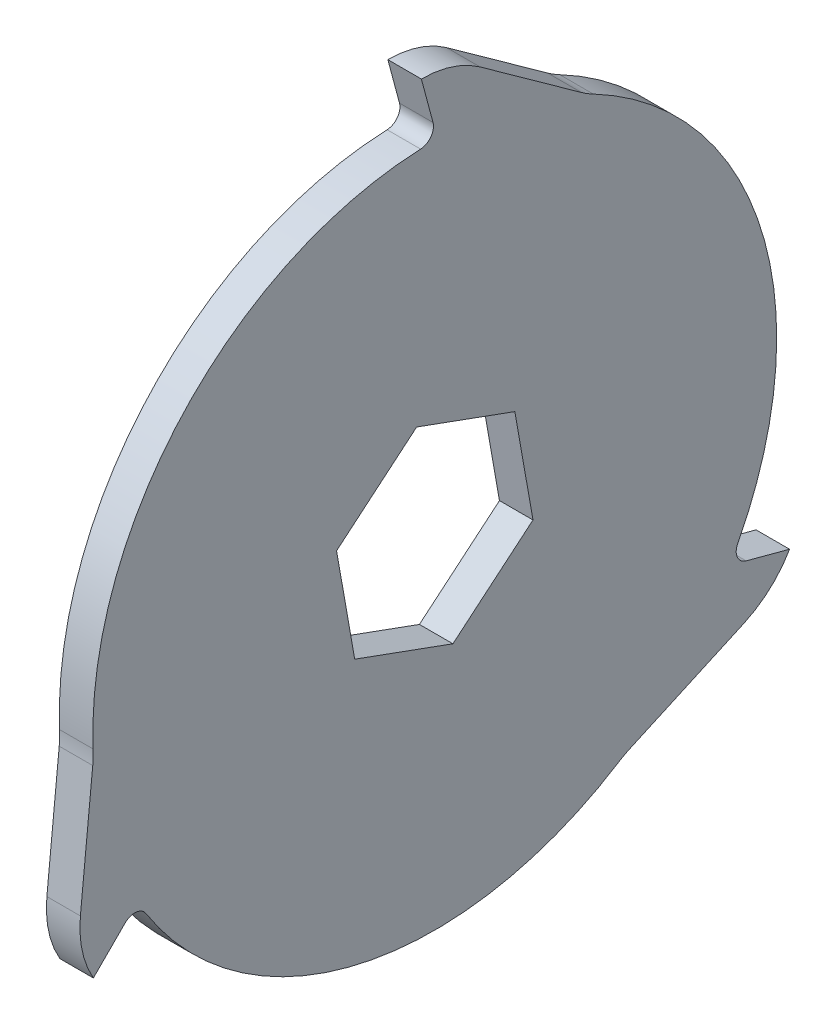
ISO-10303-21;
HEADER;
FILE_DESCRIPTION(('STEP AP214'),'2;1');
FILE_NAME('part.step','',(''),(''),'','','');
FILE_SCHEMA(('AUTOMOTIVE_DESIGN { 1 0 10303 214 1 1 1 1 }'));
ENDSEC;
DATA;
#1=APPLICATION_CONTEXT('core data for automotive mechanical design processes');
#2=APPLICATION_PROTOCOL_DEFINITION('international standard','automotive_design',2000,#1);
#3=PRODUCT_CONTEXT('',#1,'mechanical');
#4=PRODUCT('Part','Part','',(#3));
#5=PRODUCT_RELATED_PRODUCT_CATEGORY('part','',(#4));
#6=PRODUCT_DEFINITION_FORMATION('','',#4);
#7=PRODUCT_DEFINITION_CONTEXT('part definition',#1,'design');
#8=PRODUCT_DEFINITION('design','',#6,#7);
#9=PRODUCT_DEFINITION_SHAPE('','',#8);
#10=(LENGTH_UNIT() NAMED_UNIT(*) SI_UNIT(.MILLI.,.METRE.));
#11=(NAMED_UNIT(*) PLANE_ANGLE_UNIT() SI_UNIT($,.RADIAN.));
#12=(NAMED_UNIT(*) SI_UNIT($,.STERADIAN.) SOLID_ANGLE_UNIT());
#13=UNCERTAINTY_MEASURE_WITH_UNIT(LENGTH_MEASURE(1.E-05),#10,'distance_accuracy_value','');
#14=(GEOMETRIC_REPRESENTATION_CONTEXT(3) GLOBAL_UNCERTAINTY_ASSIGNED_CONTEXT((#13)) GLOBAL_UNIT_ASSIGNED_CONTEXT((#10,
#11,#12)) REPRESENTATION_CONTEXT('',''));
#15=CARTESIAN_POINT('',(0.,0.,0.));
#16=DIRECTION('',(0.,0.,1.));
#17=DIRECTION('',(1.,0.,0.));
#18=AXIS2_PLACEMENT_3D('',#15,#16,#17);
#19=CARTESIAN_POINT('',(2.5,0.,0.));
#20=DIRECTION('',(-1.,0.,0.));
#21=DIRECTION('',(0.,0.,1.));
#22=AXIS2_PLACEMENT_3D('',#19,#20,#21);
#23=CYLINDRICAL_SURFACE('',#22,51.);
#24=DIRECTION('',(1.,0.,0.));
#25=VECTOR('',#24,1.);
#26=CARTESIAN_POINT('',(-2.5,-23.6493995953492,-45.1852398331523));
#27=LINE('',#26,#25);
#28=CARTESIAN_POINT('',(-2.5,-23.6493995953492,-45.1852398331523));
#29=VERTEX_POINT('',#28);
#30=CARTESIAN_POINT('',(2.5,-23.6493995953492,-45.1852398331523));
#31=VERTEX_POINT('',#30);
#32=EDGE_CURVE('E247',#29,#31,#27,.T.);
#33=ORIENTED_EDGE('',*,*,#32,.F.);
#34=CARTESIAN_POINT('',(-2.5,0.,0.));
#35=DIRECTION('',(1.,0.,0.));
#36=DIRECTION('',(0.,0.,-1.));
#37=AXIS2_PLACEMENT_3D('',#34,#35,#36);
#38=CIRCLE('',#37,51.);
#39=CARTESIAN_POINT('',(-2.5,45.1852398331523,-23.6493995953494));
#40=VERTEX_POINT('',#39);
#41=EDGE_CURVE('E376',#29,#40,#38,.T.);
#42=ORIENTED_EDGE('',*,*,#41,.T.);
#43=DIRECTION('',(1.,0.,0.));
#44=VECTOR('',#43,1.);
#45=CARTESIAN_POINT('',(-2.5,45.1852398331523,-23.6493995953494));
#46=LINE('',#45,#44);
#47=CARTESIAN_POINT('',(2.5,45.1852398331523,-23.6493995953494));
#48=VERTEX_POINT('',#47);
#49=EDGE_CURVE('E325',#40,#48,#46,.T.);
#50=ORIENTED_EDGE('',*,*,#49,.T.);
#51=CARTESIAN_POINT('',(2.5,0.,0.));
#52=DIRECTION('',(1.,0.,0.));
#53=DIRECTION('',(0.,0.,-1.));
#54=AXIS2_PLACEMENT_3D('',#51,#52,#53);
#55=CIRCLE('',#54,51.);
#56=EDGE_CURVE('E42',#31,#48,#55,.T.);
#57=ORIENTED_EDGE('',*,*,#56,.F.);
#58=EDGE_LOOP('',(#33,#42,#50,#57));
#59=FACE_BOUND('',#58,.T.);
#60=ADVANCED_FACE('F32',(#59),#23,.T.);
#61=CARTESIAN_POINT('',(-2.5,-27.3068657739276,43.0736007503981));
#62=VERTEX_POINT('',#61);
#63=CARTESIAN_POINT('',(-2.5,-43.0736007503979,-27.3068657739281));
#64=VERTEX_POINT('',#63);
#65=EDGE_CURVE('E379',#62,#64,#38,.T.);
#66=ORIENTED_EDGE('',*,*,#65,.T.);
#67=DIRECTION('',(1.,0.,0.));
#68=VECTOR('',#67,1.);
#69=CARTESIAN_POINT('',(-2.5,-43.0736007503978,-27.3068657739281));
#70=LINE('',#69,#68);
#71=CARTESIAN_POINT('',(2.5,-43.0736007503979,-27.3068657739281));
#72=VERTEX_POINT('',#71);
#73=EDGE_CURVE('E56',#64,#72,#70,.T.);
#74=ORIENTED_EDGE('',*,*,#73,.T.);
#75=CARTESIAN_POINT('',(2.5,-27.3068657739276,43.0736007503981));
#76=VERTEX_POINT('',#75);
#77=EDGE_CURVE('E41',#76,#72,#55,.T.);
#78=ORIENTED_EDGE('',*,*,#77,.F.);
#79=DIRECTION('',(1.,0.,0.));
#80=VECTOR('',#79,1.);
#81=CARTESIAN_POINT('',(-2.5,-27.3068657739276,43.0736007503981));
#82=LINE('',#81,#80);
#83=EDGE_CURVE('E286',#62,#76,#82,.T.);
#84=ORIENTED_EDGE('',*,*,#83,.F.);
#85=EDGE_LOOP('',(#66,#74,#78,#84));
#86=FACE_BOUND('',#85,.T.);
#87=ADVANCED_FACE('F401',(#86),#23,.T.);
#88=CARTESIAN_POINT('',(2.5,0.,0.));
#89=DIRECTION('',(1.,0.,0.));
#90=DIRECTION('',(0.,0.,-1.));
#91=AXIS2_PLACEMENT_3D('',#88,#89,#90);
#92=PLANE('',#91);
#93=CARTESIAN_POINT('',(2.5,50.9562653692771,2.11163908275383));
#94=VERTEX_POINT('',#93);
#95=CARTESIAN_POINT('',(2.5,-2.11163908275438,50.9562653692771));
#96=VERTEX_POINT('',#95);
#97=EDGE_CURVE('E11',#94,#96,#55,.T.);
#98=ORIENTED_EDGE('',*,*,#97,.T.);
#99=CARTESIAN_POINT('',(2.5,-2.73270940121155,65.9434022425939));
#100=DIRECTION('',(-1.,0.,0.));
#101=DIRECTION('',(0.,0.866025403784436,0.500000000000004));
#102=AXIS2_PLACEMENT_3D('',#99,#100,#101);
#103=CIRCLE('',#102,15.);
#104=CARTESIAN_POINT('',(2.5,-4.21867035780101,51.0171863780322));
#105=VERTEX_POINT('',#104);
#106=EDGE_CURVE('E273',#96,#105,#103,.T.);
#107=ORIENTED_EDGE('',*,*,#106,.T.);
#108=DIRECTION('',(0.,-0.995081057637443,0.0990640637726305));
#109=VECTOR('',#108,1.);
#110=CARTESIAN_POINT('',(2.5,-4.21867035780101,51.0171863780322));
#111=LINE('',#110,#109);
#112=CARTESIAN_POINT('',(2.5,-22.7242225356181,52.8594837336301));
#113=VERTEX_POINT('',#112);
#114=EDGE_CURVE('E254',#105,#113,#111,.T.);
#115=ORIENTED_EDGE('',*,*,#114,.T.);
#116=CARTESIAN_POINT('',(2.5,-24.2101834922076,37.9332678690685));
#117=DIRECTION('',(1.,0.,0.));
#118=DIRECTION('',(0.,-0.866025403784436,-0.500000000000004));
#119=AXIS2_PLACEMENT_3D('',#116,#117,#118);
#120=CIRCLE('',#119,15.);
#121=CARTESIAN_POINT('',(2.5,-31.7101834922077,50.923648925835));
#122=VERTEX_POINT('',#121);
#123=EDGE_CURVE('E243',#113,#122,#120,.T.);
#124=ORIENTED_EDGE('',*,*,#123,.T.);
#125=DIRECTION('',(0.,0.707106781186546,-0.707106781186549));
#126=VECTOR('',#125,1.);
#127=CARTESIAN_POINT('',(2.5,-31.7101834922077,50.923648925835));
#128=LINE('',#127,#126);
#129=CARTESIAN_POINT('',(2.5,-26.963509692885,46.1769751265124));
#130=VERTEX_POINT('',#129);
#131=EDGE_CURVE('E268',#122,#130,#128,.T.);
#132=ORIENTED_EDGE('',*,*,#131,.T.);
#133=CARTESIAN_POINT('',(2.5,-28.3777232552581,44.7627615641393));
#134=DIRECTION('',(-1.,0.,0.));
#135=DIRECTION('',(0.,-0.866025403784436,-0.500000000000004));
#136=AXIS2_PLACEMENT_3D('',#133,#134,#135);
#137=CIRCLE('',#136,2.);
#138=EDGE_CURVE('E271',#130,#76,#137,.T.);
#139=ORIENTED_EDGE('',*,*,#138,.T.);
#140=ORIENTED_EDGE('',*,*,#77,.T.);
#141=CARTESIAN_POINT('',(2.5,-55.742306853456,-35.3382968839069));
#142=DIRECTION('',(-1.,0.,0.));
#143=DIRECTION('',(0.,-0.866025403784443,0.499999999999992));
#144=AXIS2_PLACEMENT_3D('',#141,#142,#143);
#145=CIRCLE('',#144,15.);
#146=CARTESIAN_POINT('',(2.5,-42.0728442540807,-29.1620688890644));
#147=VERTEX_POINT('',#146);
#148=EDGE_CURVE('E226',#72,#147,#145,.T.);
#149=ORIENTED_EDGE('',*,*,#148,.T.);
#150=DIRECTION('',(0.,0.411748532989506,-0.911297506625026));
#151=VECTOR('',#150,1.);
#152=CARTESIAN_POINT('',(2.5,-42.0728442540807,-29.1620688890644));
#153=LINE('',#152,#151);
#154=CARTESIAN_POINT('',(2.5,-34.4155444764447,-46.1094958639113));
#155=VERTEX_POINT('',#154);
#156=EDGE_CURVE('E223',#147,#155,#153,.T.);
#157=ORIENTED_EDGE('',*,*,#156,.T.);
#158=CARTESIAN_POINT('',(2.5,-20.7460818770693,-39.9332678690688));
#159=DIRECTION('',(1.,0.,0.));
#160=DIRECTION('',(0.,0.866025403784443,-0.499999999999992));
#161=AXIS2_PLACEMENT_3D('',#158,#159,#160);
#162=CIRCLE('',#161,15.);
#163=CARTESIAN_POINT('',(2.5,-28.2460818770692,-52.9236489258354));
#164=VERTEX_POINT('',#163);
#165=EDGE_CURVE('E234',#155,#164,#162,.T.);
#166=ORIENTED_EDGE('',*,*,#165,.T.);
#167=DIRECTION('',(0.,0.258819045102518,0.965925826289069));
#168=VECTOR('',#167,1.);
#169=CARTESIAN_POINT('',(2.5,-28.2460818770692,-52.9236489258354));
#170=LINE('',#169,#168);
#171=CARTESIAN_POINT('',(2.5,-26.5086786830391,-46.4395719324827));
#172=VERTEX_POINT('',#171);
#173=EDGE_CURVE('E201',#164,#172,#170,.T.);
#174=ORIENTED_EDGE('',*,*,#173,.T.);
#175=CARTESIAN_POINT('',(2.5,-24.576827030461,-46.9572100226877));
#176=DIRECTION('',(-1.,0.,0.));
#177=DIRECTION('',(0.,0.866025403784443,-0.499999999999992));
#178=AXIS2_PLACEMENT_3D('',#175,#176,#177);
#179=CIRCLE('',#178,2.);
#180=EDGE_CURVE('E237',#172,#31,#179,.T.);
#181=ORIENTED_EDGE('',*,*,#180,.T.);
#182=ORIENTED_EDGE('',*,*,#56,.T.);
#183=CARTESIAN_POINT('',(2.5,58.4750162546676,-30.6051053586874));
#184=DIRECTION('',(-1.,0.,0.));
#185=DIRECTION('',(0.,0.,-1.));
#186=AXIS2_PLACEMENT_3D('',#183,#184,#185);
#187=CIRCLE('',#186,15.);
#188=CARTESIAN_POINT('',(2.5,46.2915146118817,-21.8551174889682));
#189=VERTEX_POINT('',#188);
#190=EDGE_CURVE('E315',#48,#189,#187,.T.);
#191=ORIENTED_EDGE('',*,*,#190,.T.);
#192=DIRECTION('',(0.,0.583332524647945,0.812233442852395));
#193=VECTOR('',#192,1.);
#194=CARTESIAN_POINT('',(2.5,46.2915146118817,-21.8551174889682));
#195=LINE('',#194,#193);
#196=CARTESIAN_POINT('',(2.5,57.139767012063,-6.74998786971917));
#197=VERTEX_POINT('',#196);
#198=EDGE_CURVE('E296',#189,#197,#195,.T.);
#199=ORIENTED_EDGE('',*,*,#198,.T.);
#200=CARTESIAN_POINT('',(2.5,44.9562653692771,2.));
#201=DIRECTION('',(1.,0.,0.));
#202=DIRECTION('',(0.,0.,1.));
#203=AXIS2_PLACEMENT_3D('',#200,#201,#202);
#204=CIRCLE('',#203,15.);
#205=CARTESIAN_POINT('',(2.5,59.9562653692771,2.));
#206=VERTEX_POINT('',#205);
#207=EDGE_CURVE('E280',#197,#206,#204,.T.);
#208=ORIENTED_EDGE('',*,*,#207,.T.);
#209=DIRECTION('',(0.,-0.96592582628907,-0.258819045102514));
#210=VECTOR('',#209,1.);
#211=CARTESIAN_POINT('',(2.5,59.9562653692771,2.));
#212=LINE('',#211,#210);
#213=CARTESIAN_POINT('',(2.5,53.4721883759244,0.262596805969956));
#214=VERTEX_POINT('',#213);
#215=EDGE_CURVE('E310',#206,#214,#212,.T.);
#216=ORIENTED_EDGE('',*,*,#215,.T.);
#217=CARTESIAN_POINT('',(2.5,52.9545502857193,2.1944484585481));
#218=DIRECTION('',(-1.,0.,0.));
#219=DIRECTION('',(0.,0.,1.));
#220=AXIS2_PLACEMENT_3D('',#217,#218,#219);
#221=CIRCLE('',#220,2.);
#222=EDGE_CURVE('E313',#214,#94,#221,.T.);
#223=ORIENTED_EDGE('',*,*,#222,.T.);
#224=EDGE_LOOP('',(#98,#107,#115,#124,#132,#139,#140,#149,#157,#166,#174,#181,#182,#191,#199,
#208,#216,#223));
#225=FACE_BOUND('',#224,.T.);
#226=DIRECTION('',(0.,0.342020143325663,0.93969262078591));
#227=VECTOR('',#226,1.);
#228=CARTESIAN_POINT('',(2.5,10.0200671860756,-11.9414510670408));
#229=LINE('',#228,#227);
#230=CARTESIAN_POINT('',(2.5,10.0200671860756,-11.9414510670408));
#231=VERTEX_POINT('',#230);
#232=CARTESIAN_POINT('',(2.5,15.351633575144,2.70690719724793));
#233=VERTEX_POINT('',#232);
#234=EDGE_CURVE('E335',#231,#233,#229,.T.);
#235=ORIENTED_EDGE('',*,*,#234,.F.);
#236=DIRECTION('',(0.,0.984807753012207,0.173648177666936));
#237=VECTOR('',#236,1.);
#238=CARTESIAN_POINT('',(2.5,-5.33156638906834,-14.6483582642888));
#239=LINE('',#238,#237);
#240=CARTESIAN_POINT('',(2.5,-5.33156638906834,-14.6483582642888));
#241=VERTEX_POINT('',#240);
#242=EDGE_CURVE('E333',#241,#231,#239,.T.);
#243=ORIENTED_EDGE('',*,*,#242,.F.);
#244=DIRECTION('',(0.,0.642787609686544,-0.766044443118974));
#245=VECTOR('',#244,1.);
#246=CARTESIAN_POINT('',(2.5,-15.351633575144,-2.70690719724792));
#247=LINE('',#246,#245);
#248=CARTESIAN_POINT('',(2.5,-15.351633575144,-2.70690719724792));
#249=VERTEX_POINT('',#248);
#250=EDGE_CURVE('E345',#249,#241,#247,.T.);
#251=ORIENTED_EDGE('',*,*,#250,.F.);
#252=DIRECTION('',(0.,-0.342020143325663,-0.939692620785911));
#253=VECTOR('',#252,1.);
#254=CARTESIAN_POINT('',(2.5,-10.0200671860756,11.9414510670408));
#255=LINE('',#254,#253);
#256=CARTESIAN_POINT('',(2.5,-10.0200671860756,11.9414510670408));
#257=VERTEX_POINT('',#256);
#258=EDGE_CURVE('E342',#257,#249,#255,.T.);
#259=ORIENTED_EDGE('',*,*,#258,.F.);
#260=DIRECTION('',(0.,-0.984807753012207,-0.173648177666936));
#261=VECTOR('',#260,1.);
#262=CARTESIAN_POINT('',(2.5,5.33156638906834,14.6483582642888));
#263=LINE('',#262,#261);
#264=CARTESIAN_POINT('',(2.5,5.33156638906834,14.6483582642888));
#265=VERTEX_POINT('',#264);
#266=EDGE_CURVE('E340',#265,#257,#263,.T.);
#267=ORIENTED_EDGE('',*,*,#266,.F.);
#268=DIRECTION('',(0.,-0.642787609686544,0.766044443118974));
#269=VECTOR('',#268,1.);
#270=CARTESIAN_POINT('',(2.5,15.351633575144,2.70690719724793));
#271=LINE('',#270,#269);
#272=EDGE_CURVE('E338',#233,#265,#271,.T.);
#273=ORIENTED_EDGE('',*,*,#272,.F.);
#274=EDGE_LOOP('',(#235,#243,#251,#259,#267,#273));
#275=FACE_BOUND('',#274,.T.);
#276=ADVANCED_FACE('F387',(#225,#275),#92,.T.);
#277=CARTESIAN_POINT('',(-2.5,0.,0.));
#278=DIRECTION('',(1.,0.,0.));
#279=DIRECTION('',(0.,0.,-1.));
#280=AXIS2_PLACEMENT_3D('',#277,#278,#279);
#281=PLANE('',#280);
#282=CARTESIAN_POINT('',(-2.5,50.9562653692771,2.11163908275383));
#283=VERTEX_POINT('',#282);
#284=CARTESIAN_POINT('',(-2.5,-2.11163908275438,50.9562653692771));
#285=VERTEX_POINT('',#284);
#286=EDGE_CURVE('E36',#283,#285,#38,.T.);
#287=ORIENTED_EDGE('',*,*,#286,.F.);
#288=CARTESIAN_POINT('',(-2.5,52.9545502857193,2.1944484585481));
#289=DIRECTION('',(-1.,0.,0.));
#290=DIRECTION('',(0.,0.,1.));
#291=AXIS2_PLACEMENT_3D('',#288,#289,#290);
#292=CIRCLE('',#291,2.);
#293=CARTESIAN_POINT('',(-2.5,53.4721883759244,0.262596805969956));
#294=VERTEX_POINT('',#293);
#295=EDGE_CURVE('E299',#294,#283,#292,.T.);
#296=ORIENTED_EDGE('',*,*,#295,.F.);
#297=DIRECTION('',(0.,-0.96592582628907,-0.258819045102514));
#298=VECTOR('',#297,1.);
#299=CARTESIAN_POINT('',(-2.5,59.9562653692771,2.));
#300=LINE('',#299,#298);
#301=CARTESIAN_POINT('',(-2.5,59.9562653692771,2.));
#302=VERTEX_POINT('',#301);
#303=EDGE_CURVE('E295',#302,#294,#300,.T.);
#304=ORIENTED_EDGE('',*,*,#303,.F.);
#305=CARTESIAN_POINT('',(-2.5,44.9562653692771,2.));
#306=DIRECTION('',(1.,0.,0.));
#307=DIRECTION('',(0.,0.,1.));
#308=AXIS2_PLACEMENT_3D('',#305,#306,#307);
#309=CIRCLE('',#308,15.);
#310=CARTESIAN_POINT('',(-2.5,57.139767012063,-6.74998786971917));
#311=VERTEX_POINT('',#310);
#312=EDGE_CURVE('E292',#311,#302,#309,.T.);
#313=ORIENTED_EDGE('',*,*,#312,.F.);
#314=DIRECTION('',(0.,0.583332524647945,0.812233442852395));
#315=VECTOR('',#314,1.);
#316=CARTESIAN_POINT('',(-2.5,46.2915146118817,-21.8551174889682));
#317=LINE('',#316,#315);
#318=CARTESIAN_POINT('',(-2.5,46.2915146118817,-21.8551174889682));
#319=VERTEX_POINT('',#318);
#320=EDGE_CURVE('E304',#319,#311,#317,.T.);
#321=ORIENTED_EDGE('',*,*,#320,.F.);
#322=CARTESIAN_POINT('',(-2.5,58.4750162546676,-30.6051053586874));
#323=DIRECTION('',(-1.,0.,0.));
#324=DIRECTION('',(0.,0.,-1.));
#325=AXIS2_PLACEMENT_3D('',#322,#323,#324);
#326=CIRCLE('',#325,15.);
#327=EDGE_CURVE('E301',#40,#319,#326,.T.);
#328=ORIENTED_EDGE('',*,*,#327,.F.);
#329=ORIENTED_EDGE('',*,*,#41,.F.);
#330=CARTESIAN_POINT('',(-2.5,-24.576827030461,-46.9572100226877));
#331=DIRECTION('',(-1.,0.,0.));
#332=DIRECTION('',(0.,0.866025403784443,-0.499999999999992));
#333=AXIS2_PLACEMENT_3D('',#330,#331,#332);
#334=CIRCLE('',#333,2.);
#335=CARTESIAN_POINT('',(-2.5,-26.5086786830391,-46.4395719324827));
#336=VERTEX_POINT('',#335);
#337=EDGE_CURVE('E219',#336,#29,#334,.T.);
#338=ORIENTED_EDGE('',*,*,#337,.F.);
#339=DIRECTION('',(0.,0.258819045102518,0.965925826289069));
#340=VECTOR('',#339,1.);
#341=CARTESIAN_POINT('',(-2.5,-28.2460818770692,-52.9236489258354));
#342=LINE('',#341,#340);
#343=CARTESIAN_POINT('',(-2.5,-28.2460818770692,-52.9236489258354));
#344=VERTEX_POINT('',#343);
#345=EDGE_CURVE('E199',#344,#336,#342,.T.);
#346=ORIENTED_EDGE('',*,*,#345,.F.);
#347=CARTESIAN_POINT('',(-2.5,-20.7460818770693,-39.9332678690688));
#348=DIRECTION('',(1.,0.,0.));
#349=DIRECTION('',(0.,0.866025403784443,-0.499999999999992));
#350=AXIS2_PLACEMENT_3D('',#347,#348,#349);
#351=CIRCLE('',#350,15.);
#352=CARTESIAN_POINT('',(-2.5,-34.4155444764447,-46.1094958639113));
#353=VERTEX_POINT('',#352);
#354=EDGE_CURVE('E216',#353,#344,#351,.T.);
#355=ORIENTED_EDGE('',*,*,#354,.F.);
#356=DIRECTION('',(0.,0.411748532989506,-0.911297506625026));
#357=VECTOR('',#356,1.);
#358=CARTESIAN_POINT('',(-2.5,-42.0728442540807,-29.1620688890644));
#359=LINE('',#358,#357);
#360=CARTESIAN_POINT('',(-2.5,-42.0728442540807,-29.1620688890644));
#361=VERTEX_POINT('',#360);
#362=EDGE_CURVE('E207',#361,#353,#359,.T.);
#363=ORIENTED_EDGE('',*,*,#362,.F.);
#364=CARTESIAN_POINT('',(-2.5,-55.742306853456,-35.3382968839069));
#365=DIRECTION('',(-1.,0.,0.));
#366=DIRECTION('',(0.,-0.866025403784443,0.499999999999992));
#367=AXIS2_PLACEMENT_3D('',#364,#365,#366);
#368=CIRCLE('',#367,15.);
#369=EDGE_CURVE('E230',#64,#361,#368,.T.);
#370=ORIENTED_EDGE('',*,*,#369,.F.);
#371=ORIENTED_EDGE('',*,*,#65,.F.);
#372=CARTESIAN_POINT('',(-2.5,-28.3777232552581,44.7627615641393));
#373=DIRECTION('',(-1.,0.,0.));
#374=DIRECTION('',(0.,-0.866025403784436,-0.500000000000004));
#375=AXIS2_PLACEMENT_3D('',#372,#373,#374);
#376=CIRCLE('',#375,2.);
#377=CARTESIAN_POINT('',(-2.5,-26.963509692885,46.1769751265124));
#378=VERTEX_POINT('',#377);
#379=EDGE_CURVE('E257',#378,#62,#376,.T.);
#380=ORIENTED_EDGE('',*,*,#379,.F.);
#381=DIRECTION('',(0.,0.707106781186546,-0.707106781186549));
#382=VECTOR('',#381,1.);
#383=CARTESIAN_POINT('',(-2.5,-31.7101834922077,50.923648925835));
#384=LINE('',#383,#382);
#385=CARTESIAN_POINT('',(-2.5,-31.7101834922077,50.923648925835));
#386=VERTEX_POINT('',#385);
#387=EDGE_CURVE('E253',#386,#378,#384,.T.);
#388=ORIENTED_EDGE('',*,*,#387,.F.);
#389=CARTESIAN_POINT('',(-2.5,-24.2101834922076,37.9332678690685));
#390=DIRECTION('',(1.,0.,0.));
#391=DIRECTION('',(0.,-0.866025403784436,-0.500000000000004));
#392=AXIS2_PLACEMENT_3D('',#389,#390,#391);
#393=CIRCLE('',#392,15.);
#394=CARTESIAN_POINT('',(-2.5,-22.7242225356181,52.8594837336301));
#395=VERTEX_POINT('',#394);
#396=EDGE_CURVE('E250',#395,#386,#393,.T.);
#397=ORIENTED_EDGE('',*,*,#396,.F.);
#398=DIRECTION('',(0.,-0.995081057637443,0.0990640637726305));
#399=VECTOR('',#398,1.);
#400=CARTESIAN_POINT('',(-2.5,-4.21867035780101,51.0171863780322));
#401=LINE('',#400,#399);
#402=CARTESIAN_POINT('',(-2.5,-4.21867035780101,51.0171863780322));
#403=VERTEX_POINT('',#402);
#404=EDGE_CURVE('E262',#403,#395,#401,.T.);
#405=ORIENTED_EDGE('',*,*,#404,.F.);
#406=CARTESIAN_POINT('',(-2.5,-2.73270940121155,65.9434022425939));
#407=DIRECTION('',(-1.,0.,0.));
#408=DIRECTION('',(0.,0.866025403784436,0.500000000000004));
#409=AXIS2_PLACEMENT_3D('',#406,#407,#408);
#410=CIRCLE('',#409,15.);
#411=EDGE_CURVE('E259',#285,#403,#410,.T.);
#412=ORIENTED_EDGE('',*,*,#411,.F.);
#413=EDGE_LOOP('',(#287,#296,#304,#313,#321,#328,#329,#338,#346,#355,#363,#370,#371,#380,#388,
#397,#405,#412));
#414=FACE_BOUND('',#413,.T.);
#415=DIRECTION('',(0.,0.984807753012207,0.173648177666936));
#416=VECTOR('',#415,1.);
#417=CARTESIAN_POINT('',(-2.5,-5.33156638906834,-14.6483582642888));
#418=LINE('',#417,#416);
#419=CARTESIAN_POINT('',(-2.5,-5.33156638906834,-14.6483582642888));
#420=VERTEX_POINT('',#419);
#421=CARTESIAN_POINT('',(-2.5,10.0200671860756,-11.9414510670408));
#422=VERTEX_POINT('',#421);
#423=EDGE_CURVE('E322',#420,#422,#418,.T.);
#424=ORIENTED_EDGE('',*,*,#423,.T.);
#425=DIRECTION('',(0.,0.342020143325663,0.93969262078591));
#426=VECTOR('',#425,1.);
#427=CARTESIAN_POINT('',(-2.5,10.0200671860756,-11.9414510670408));
#428=LINE('',#427,#426);
#429=CARTESIAN_POINT('',(-2.5,15.351633575144,2.70690719724793));
#430=VERTEX_POINT('',#429);
#431=EDGE_CURVE('E350',#422,#430,#428,.T.);
#432=ORIENTED_EDGE('',*,*,#431,.T.);
#433=DIRECTION('',(0.,-0.642787609686544,0.766044443118974));
#434=VECTOR('',#433,1.);
#435=CARTESIAN_POINT('',(-2.5,15.351633575144,2.70690719724793));
#436=LINE('',#435,#434);
#437=CARTESIAN_POINT('',(-2.5,5.33156638906834,14.6483582642888));
#438=VERTEX_POINT('',#437);
#439=EDGE_CURVE('E353',#430,#438,#436,.T.);
#440=ORIENTED_EDGE('',*,*,#439,.T.);
#441=DIRECTION('',(0.,-0.984807753012207,-0.173648177666936));
#442=VECTOR('',#441,1.);
#443=CARTESIAN_POINT('',(-2.5,5.33156638906834,14.6483582642888));
#444=LINE('',#443,#442);
#445=CARTESIAN_POINT('',(-2.5,-10.0200671860756,11.9414510670408));
#446=VERTEX_POINT('',#445);
#447=EDGE_CURVE('E356',#438,#446,#444,.T.);
#448=ORIENTED_EDGE('',*,*,#447,.T.);
#449=DIRECTION('',(0.,-0.342020143325663,-0.939692620785911));
#450=VECTOR('',#449,1.);
#451=CARTESIAN_POINT('',(-2.5,-10.0200671860756,11.9414510670408));
#452=LINE('',#451,#450);
#453=CARTESIAN_POINT('',(-2.5,-15.351633575144,-2.70690719724792));
#454=VERTEX_POINT('',#453);
#455=EDGE_CURVE('E359',#446,#454,#452,.T.);
#456=ORIENTED_EDGE('',*,*,#455,.T.);
#457=DIRECTION('',(0.,0.642787609686544,-0.766044443118974));
#458=VECTOR('',#457,1.);
#459=CARTESIAN_POINT('',(-2.5,-15.351633575144,-2.70690719724792));
#460=LINE('',#459,#458);
#461=EDGE_CURVE('E336',#454,#420,#460,.T.);
#462=ORIENTED_EDGE('',*,*,#461,.T.);
#463=EDGE_LOOP('',(#424,#432,#440,#448,#456,#462));
#464=FACE_BOUND('',#463,.T.);
#465=ADVANCED_FACE('F213',(#414,#464),#281,.F.);
#466=ORIENTED_EDGE('',*,*,#286,.T.);
#467=DIRECTION('',(1.,0.,0.));
#468=VECTOR('',#467,1.);
#469=CARTESIAN_POINT('',(-2.5,-2.11163908275438,50.9562653692771));
#470=LINE('',#469,#468);
#471=EDGE_CURVE('E283',#285,#96,#470,.T.);
#472=ORIENTED_EDGE('',*,*,#471,.T.);
#473=ORIENTED_EDGE('',*,*,#97,.F.);
#474=DIRECTION('',(1.,0.,0.));
#475=VECTOR('',#474,1.);
#476=CARTESIAN_POINT('',(-2.5,50.9562653692771,2.11163908275383));
#477=LINE('',#476,#475);
#478=EDGE_CURVE('E327',#283,#94,#477,.T.);
#479=ORIENTED_EDGE('',*,*,#478,.F.);
#480=EDGE_LOOP('',(#466,#472,#473,#479));
#481=FACE_BOUND('',#480,.T.);
#482=ADVANCED_FACE('F34',(#481),#23,.T.);
#483=CARTESIAN_POINT('',(2.5,-5.33156638906834,-14.6483582642888));
#484=DIRECTION('',(0.,-0.173648177666936,0.984807753012207));
#485=DIRECTION('',(0.,-0.984807753012207,-0.173648177666936));
#486=AXIS2_PLACEMENT_3D('',#483,#484,#485);
#487=PLANE('',#486);
#488=ORIENTED_EDGE('',*,*,#423,.F.);
#489=DIRECTION('',(-1.,0.,0.));
#490=VECTOR('',#489,1.);
#491=CARTESIAN_POINT('',(2.5,-5.33156638906834,-14.6483582642888));
#492=LINE('',#491,#490);
#493=EDGE_CURVE('E347',#241,#420,#492,.T.);
#494=ORIENTED_EDGE('',*,*,#493,.F.);
#495=ORIENTED_EDGE('',*,*,#242,.T.);
#496=DIRECTION('',(-1.,0.,0.));
#497=VECTOR('',#496,1.);
#498=CARTESIAN_POINT('',(2.5,10.0200671860756,-11.9414510670408));
#499=LINE('',#498,#497);
#500=EDGE_CURVE('E374',#231,#422,#499,.T.);
#501=ORIENTED_EDGE('',*,*,#500,.T.);
#502=EDGE_LOOP('',(#488,#494,#495,#501));
#503=FACE_BOUND('',#502,.T.);
#504=ADVANCED_FACE('F406',(#503),#487,.T.);
#505=CARTESIAN_POINT('',(2.5,10.0200671860756,-11.9414510670408));
#506=DIRECTION('',(0.,-0.93969262078591,0.342020143325663));
#507=DIRECTION('',(0.,-0.342020143325663,-0.939692620785911));
#508=AXIS2_PLACEMENT_3D('',#505,#506,#507);
#509=PLANE('',#508);
#510=ORIENTED_EDGE('',*,*,#431,.F.);
#511=ORIENTED_EDGE('',*,*,#500,.F.);
#512=ORIENTED_EDGE('',*,*,#234,.T.);
#513=DIRECTION('',(-1.,0.,0.));
#514=VECTOR('',#513,1.);
#515=CARTESIAN_POINT('',(2.5,15.351633575144,2.70690719724793));
#516=LINE('',#515,#514);
#517=EDGE_CURVE('E372',#233,#430,#516,.T.);
#518=ORIENTED_EDGE('',*,*,#517,.T.);
#519=EDGE_LOOP('',(#510,#511,#512,#518));
#520=FACE_BOUND('',#519,.T.);
#521=ADVANCED_FACE('F411',(#520),#509,.T.);
#522=CARTESIAN_POINT('',(2.5,15.351633575144,2.70690719724793));
#523=DIRECTION('',(0.,-0.766044443118974,-0.642787609686544));
#524=DIRECTION('',(0.,0.642787609686544,-0.766044443118974));
#525=AXIS2_PLACEMENT_3D('',#522,#523,#524);
#526=PLANE('',#525);
#527=ORIENTED_EDGE('',*,*,#439,.F.);
#528=ORIENTED_EDGE('',*,*,#517,.F.);
#529=ORIENTED_EDGE('',*,*,#272,.T.);
#530=DIRECTION('',(-1.,0.,0.));
#531=VECTOR('',#530,1.);
#532=CARTESIAN_POINT('',(2.5,5.33156638906834,14.6483582642888));
#533=LINE('',#532,#531);
#534=EDGE_CURVE('E370',#265,#438,#533,.T.);
#535=ORIENTED_EDGE('',*,*,#534,.T.);
#536=EDGE_LOOP('',(#527,#528,#529,#535));
#537=FACE_BOUND('',#536,.T.);
#538=ADVANCED_FACE('F420',(#537),#526,.T.);
#539=CARTESIAN_POINT('',(2.5,5.33156638906834,14.6483582642888));
#540=DIRECTION('',(0.,0.173648177666936,-0.984807753012207));
#541=DIRECTION('',(0.,0.984807753012207,0.173648177666936));
#542=AXIS2_PLACEMENT_3D('',#539,#540,#541);
#543=PLANE('',#542);
#544=ORIENTED_EDGE('',*,*,#447,.F.);
#545=ORIENTED_EDGE('',*,*,#534,.F.);
#546=ORIENTED_EDGE('',*,*,#266,.T.);
#547=DIRECTION('',(-1.,0.,0.));
#548=VECTOR('',#547,1.);
#549=CARTESIAN_POINT('',(2.5,-10.0200671860756,11.9414510670408));
#550=LINE('',#549,#548);
#551=EDGE_CURVE('E368',#257,#446,#550,.T.);
#552=ORIENTED_EDGE('',*,*,#551,.T.);
#553=EDGE_LOOP('',(#544,#545,#546,#552));
#554=FACE_BOUND('',#553,.T.);
#555=ADVANCED_FACE('F424',(#554),#543,.T.);
#556=CARTESIAN_POINT('',(2.5,-10.0200671860756,11.9414510670408));
#557=DIRECTION('',(0.,0.93969262078591,-0.342020143325663));
#558=DIRECTION('',(0.,0.342020143325663,0.93969262078591));
#559=AXIS2_PLACEMENT_3D('',#556,#557,#558);
#560=PLANE('',#559);
#561=ORIENTED_EDGE('',*,*,#455,.F.);
#562=ORIENTED_EDGE('',*,*,#551,.F.);
#563=ORIENTED_EDGE('',*,*,#258,.T.);
#564=DIRECTION('',(-1.,0.,0.));
#565=VECTOR('',#564,1.);
#566=CARTESIAN_POINT('',(2.5,-15.351633575144,-2.70690719724792));
#567=LINE('',#566,#565);
#568=EDGE_CURVE('E366',#249,#454,#567,.T.);
#569=ORIENTED_EDGE('',*,*,#568,.T.);
#570=EDGE_LOOP('',(#561,#562,#563,#569));
#571=FACE_BOUND('',#570,.T.);
#572=ADVANCED_FACE('F428',(#571),#560,.T.);
#573=CARTESIAN_POINT('',(2.5,-15.351633575144,-2.70690719724792));
#574=DIRECTION('',(0.,0.766044443118974,0.642787609686544));
#575=DIRECTION('',(0.,-0.642787609686544,0.766044443118974));
#576=AXIS2_PLACEMENT_3D('',#573,#574,#575);
#577=PLANE('',#576);
#578=ORIENTED_EDGE('',*,*,#461,.F.);
#579=ORIENTED_EDGE('',*,*,#568,.F.);
#580=ORIENTED_EDGE('',*,*,#250,.T.);
#581=ORIENTED_EDGE('',*,*,#493,.T.);
#582=EDGE_LOOP('',(#578,#579,#580,#581));
#583=FACE_BOUND('',#582,.T.);
#584=ADVANCED_FACE('F432',(#583),#577,.T.);
#585=CARTESIAN_POINT('',(-2.5,44.9562653692771,2.));
#586=DIRECTION('',(1.,0.,0.));
#587=DIRECTION('',(0.,0.,-1.));
#588=AXIS2_PLACEMENT_3D('',#585,#586,#587);
#589=CYLINDRICAL_SURFACE('',#588,15.);
#590=ORIENTED_EDGE('',*,*,#207,.F.);
#591=DIRECTION('',(1.,0.,0.));
#592=VECTOR('',#591,1.);
#593=CARTESIAN_POINT('',(-2.5,57.139767012063,-6.74998786971917));
#594=LINE('',#593,#592);
#595=EDGE_CURVE('E320',#311,#197,#594,.T.);
#596=ORIENTED_EDGE('',*,*,#595,.F.);
#597=ORIENTED_EDGE('',*,*,#312,.T.);
#598=DIRECTION('',(1.,0.,0.));
#599=VECTOR('',#598,1.);
#600=CARTESIAN_POINT('',(-2.5,59.9562653692771,2.));
#601=LINE('',#600,#599);
#602=EDGE_CURVE('E307',#302,#206,#601,.T.);
#603=ORIENTED_EDGE('',*,*,#602,.T.);
#604=EDGE_LOOP('',(#590,#596,#597,#603));
#605=FACE_BOUND('',#604,.T.);
#606=ADVANCED_FACE('F436',(#605),#589,.T.);
#607=CARTESIAN_POINT('',(-2.5,46.2915146118817,-21.8551174889682));
#608=DIRECTION('',(0.,0.812233442852395,-0.583332524647945));
#609=DIRECTION('',(0.,0.583332524647945,0.812233442852395));
#610=AXIS2_PLACEMENT_3D('',#607,#608,#609);
#611=PLANE('',#610);
#612=ORIENTED_EDGE('',*,*,#198,.F.);
#613=DIRECTION('',(1.,0.,0.));
#614=VECTOR('',#613,1.);
#615=CARTESIAN_POINT('',(-2.5,46.2915146118817,-21.8551174889682));
#616=LINE('',#615,#614);
#617=EDGE_CURVE('E323',#319,#189,#616,.T.);
#618=ORIENTED_EDGE('',*,*,#617,.F.);
#619=ORIENTED_EDGE('',*,*,#320,.T.);
#620=ORIENTED_EDGE('',*,*,#595,.T.);
#621=EDGE_LOOP('',(#612,#618,#619,#620));
#622=FACE_BOUND('',#621,.T.);
#623=ADVANCED_FACE('F440',(#622),#611,.T.);
#624=CARTESIAN_POINT('',(-2.5,58.4750162546676,-30.6051053586874));
#625=DIRECTION('',(1.,0.,0.));
#626=DIRECTION('',(0.,0.,-1.));
#627=AXIS2_PLACEMENT_3D('',#624,#625,#626);
#628=CYLINDRICAL_SURFACE('',#627,15.);
#629=ORIENTED_EDGE('',*,*,#190,.F.);
#630=ORIENTED_EDGE('',*,*,#49,.F.);
#631=ORIENTED_EDGE('',*,*,#327,.T.);
#632=ORIENTED_EDGE('',*,*,#617,.T.);
#633=EDGE_LOOP('',(#629,#630,#631,#632));
#634=FACE_BOUND('',#633,.T.);
#635=ADVANCED_FACE('F450',(#634),#628,.F.);
#636=CARTESIAN_POINT('',(-2.5,52.9545502857193,2.1944484585481));
#637=DIRECTION('',(1.,0.,0.));
#638=DIRECTION('',(0.,0.,-1.));
#639=AXIS2_PLACEMENT_3D('',#636,#637,#638);
#640=CYLINDRICAL_SURFACE('',#639,2.);
#641=ORIENTED_EDGE('',*,*,#222,.F.);
#642=DIRECTION('',(1.,0.,0.));
#643=VECTOR('',#642,1.);
#644=CARTESIAN_POINT('',(-2.5,53.4721883759244,0.262596805969956));
#645=LINE('',#644,#643);
#646=EDGE_CURVE('E330',#294,#214,#645,.T.);
#647=ORIENTED_EDGE('',*,*,#646,.F.);
#648=ORIENTED_EDGE('',*,*,#295,.T.);
#649=ORIENTED_EDGE('',*,*,#478,.T.);
#650=EDGE_LOOP('',(#641,#647,#648,#649));
#651=FACE_BOUND('',#650,.T.);
#652=ADVANCED_FACE('F446',(#651),#640,.F.);
#653=CARTESIAN_POINT('',(-2.5,59.9562653692771,2.));
#654=DIRECTION('',(0.,-0.258819045102514,0.96592582628907));
#655=DIRECTION('',(0.,-0.96592582628907,-0.258819045102514));
#656=AXIS2_PLACEMENT_3D('',#653,#654,#655);
#657=PLANE('',#656);
#658=ORIENTED_EDGE('',*,*,#215,.F.);
#659=ORIENTED_EDGE('',*,*,#602,.F.);
#660=ORIENTED_EDGE('',*,*,#303,.T.);
#661=ORIENTED_EDGE('',*,*,#646,.T.);
#662=EDGE_LOOP('',(#658,#659,#660,#661));
#663=FACE_BOUND('',#662,.T.);
#664=ADVANCED_FACE('F442',(#663),#657,.T.);
#665=CARTESIAN_POINT('',(-2.5,-24.2101834922076,37.9332678690685));
#666=DIRECTION('',(1.,0.,0.));
#667=DIRECTION('',(0.,0.,-1.));
#668=AXIS2_PLACEMENT_3D('',#665,#666,#667);
#669=CYLINDRICAL_SURFACE('',#668,15.);
#670=ORIENTED_EDGE('',*,*,#123,.F.);
#671=DIRECTION('',(1.,0.,0.));
#672=VECTOR('',#671,1.);
#673=CARTESIAN_POINT('',(-2.5,-22.7242225356181,52.8594837336301));
#674=LINE('',#673,#672);
#675=EDGE_CURVE('E278',#395,#113,#674,.T.);
#676=ORIENTED_EDGE('',*,*,#675,.F.);
#677=ORIENTED_EDGE('',*,*,#396,.T.);
#678=DIRECTION('',(1.,0.,0.));
#679=VECTOR('',#678,1.);
#680=CARTESIAN_POINT('',(-2.5,-31.7101834922077,50.923648925835));
#681=LINE('',#680,#679);
#682=EDGE_CURVE('E265',#386,#122,#681,.T.);
#683=ORIENTED_EDGE('',*,*,#682,.T.);
#684=EDGE_LOOP('',(#670,#676,#677,#683));
#685=FACE_BOUND('',#684,.T.);
#686=ADVANCED_FACE('F445',(#685),#669,.T.);
#687=CARTESIAN_POINT('',(-2.5,-4.21867035780101,51.0171863780322));
#688=DIRECTION('',(0.,0.0990640637726305,0.995081057637443));
#689=DIRECTION('',(0.,-0.995081057637443,0.0990640637726305));
#690=AXIS2_PLACEMENT_3D('',#687,#688,#689);
#691=PLANE('',#690);
#692=ORIENTED_EDGE('',*,*,#114,.F.);
#693=DIRECTION('',(1.,0.,0.));
#694=VECTOR('',#693,1.);
#695=CARTESIAN_POINT('',(-2.5,-4.21867035780101,51.0171863780322));
#696=LINE('',#695,#694);
#697=EDGE_CURVE('E281',#403,#105,#696,.T.);
#698=ORIENTED_EDGE('',*,*,#697,.F.);
#699=ORIENTED_EDGE('',*,*,#404,.T.);
#700=ORIENTED_EDGE('',*,*,#675,.T.);
#701=EDGE_LOOP('',(#692,#698,#699,#700));
#702=FACE_BOUND('',#701,.T.);
#703=ADVANCED_FACE('F460',(#702),#691,.T.);
#704=CARTESIAN_POINT('',(-2.5,-2.73270940121155,65.9434022425939));
#705=DIRECTION('',(1.,0.,0.));
#706=DIRECTION('',(0.,0.,-1.));
#707=AXIS2_PLACEMENT_3D('',#704,#705,#706);
#708=CYLINDRICAL_SURFACE('',#707,15.);
#709=ORIENTED_EDGE('',*,*,#106,.F.);
#710=ORIENTED_EDGE('',*,*,#471,.F.);
#711=ORIENTED_EDGE('',*,*,#411,.T.);
#712=ORIENTED_EDGE('',*,*,#697,.T.);
#713=EDGE_LOOP('',(#709,#710,#711,#712));
#714=FACE_BOUND('',#713,.T.);
#715=ADVANCED_FACE('F469',(#714),#708,.F.);
#716=CARTESIAN_POINT('',(-2.5,-28.3777232552581,44.7627615641393));
#717=DIRECTION('',(1.,0.,0.));
#718=DIRECTION('',(0.,0.,-1.));
#719=AXIS2_PLACEMENT_3D('',#716,#717,#718);
#720=CYLINDRICAL_SURFACE('',#719,2.);
#721=ORIENTED_EDGE('',*,*,#138,.F.);
#722=DIRECTION('',(1.,0.,0.));
#723=VECTOR('',#722,1.);
#724=CARTESIAN_POINT('',(-2.5,-26.963509692885,46.1769751265124));
#725=LINE('',#724,#723);
#726=EDGE_CURVE('E289',#378,#130,#725,.T.);
#727=ORIENTED_EDGE('',*,*,#726,.F.);
#728=ORIENTED_EDGE('',*,*,#379,.T.);
#729=ORIENTED_EDGE('',*,*,#83,.T.);
#730=EDGE_LOOP('',(#721,#727,#728,#729));
#731=FACE_BOUND('',#730,.T.);
#732=ADVANCED_FACE('F465',(#731),#720,.F.);
#733=CARTESIAN_POINT('',(-2.5,-31.7101834922077,50.923648925835));
#734=DIRECTION('',(0.,-0.707106781186549,-0.707106781186546));
#735=DIRECTION('',(0.,0.707106781186546,-0.707106781186549));
#736=AXIS2_PLACEMENT_3D('',#733,#734,#735);
#737=PLANE('',#736);
#738=ORIENTED_EDGE('',*,*,#131,.F.);
#739=ORIENTED_EDGE('',*,*,#682,.F.);
#740=ORIENTED_EDGE('',*,*,#387,.T.);
#741=ORIENTED_EDGE('',*,*,#726,.T.);
#742=EDGE_LOOP('',(#738,#739,#740,#741));
#743=FACE_BOUND('',#742,.T.);
#744=ADVANCED_FACE('F462',(#743),#737,.T.);
#745=CARTESIAN_POINT('',(-2.5,-20.7460818770693,-39.9332678690688));
#746=DIRECTION('',(1.,0.,0.));
#747=DIRECTION('',(0.,0.,-1.));
#748=AXIS2_PLACEMENT_3D('',#745,#746,#747);
#749=CYLINDRICAL_SURFACE('',#748,15.);
#750=ORIENTED_EDGE('',*,*,#165,.F.);
#751=DIRECTION('',(1.,0.,0.));
#752=VECTOR('',#751,1.);
#753=CARTESIAN_POINT('',(-2.5,-34.4155444764447,-46.1094958639113));
#754=LINE('',#753,#752);
#755=EDGE_CURVE('E222',#353,#155,#754,.T.);
#756=ORIENTED_EDGE('',*,*,#755,.F.);
#757=ORIENTED_EDGE('',*,*,#354,.T.);
#758=DIRECTION('',(1.,0.,0.));
#759=VECTOR('',#758,1.);
#760=CARTESIAN_POINT('',(-2.5,-28.2460818770692,-52.9236489258354));
#761=LINE('',#760,#759);
#762=EDGE_CURVE('E196',#344,#164,#761,.T.);
#763=ORIENTED_EDGE('',*,*,#762,.T.);
#764=EDGE_LOOP('',(#750,#756,#757,#763));
#765=FACE_BOUND('',#764,.T.);
#766=ADVANCED_FACE('F221',(#765),#749,.T.);
#767=CARTESIAN_POINT('',(-2.5,-42.0728442540807,-29.1620688890644));
#768=DIRECTION('',(0.,-0.911297506625026,-0.411748532989506));
#769=DIRECTION('',(0.,0.411748532989506,-0.911297506625026));
#770=AXIS2_PLACEMENT_3D('',#767,#768,#769);
#771=PLANE('',#770);
#772=ORIENTED_EDGE('',*,*,#156,.F.);
#773=DIRECTION('',(1.,0.,0.));
#774=VECTOR('',#773,1.);
#775=CARTESIAN_POINT('',(-2.5,-42.0728442540807,-29.1620688890644));
#776=LINE('',#775,#774);
#777=EDGE_CURVE('E244',#361,#147,#776,.T.);
#778=ORIENTED_EDGE('',*,*,#777,.F.);
#779=ORIENTED_EDGE('',*,*,#362,.T.);
#780=ORIENTED_EDGE('',*,*,#755,.T.);
#781=EDGE_LOOP('',(#772,#778,#779,#780));
#782=FACE_BOUND('',#781,.T.);
#783=ADVANCED_FACE('F396',(#782),#771,.T.);
#784=CARTESIAN_POINT('',(-2.5,-55.742306853456,-35.3382968839069));
#785=DIRECTION('',(1.,0.,0.));
#786=DIRECTION('',(0.,0.,-1.));
#787=AXIS2_PLACEMENT_3D('',#784,#785,#786);
#788=CYLINDRICAL_SURFACE('',#787,15.);
#789=ORIENTED_EDGE('',*,*,#148,.F.);
#790=ORIENTED_EDGE('',*,*,#73,.F.);
#791=ORIENTED_EDGE('',*,*,#369,.T.);
#792=ORIENTED_EDGE('',*,*,#777,.T.);
#793=EDGE_LOOP('',(#789,#790,#791,#792));
#794=FACE_BOUND('',#793,.T.);
#795=ADVANCED_FACE('F393',(#794),#788,.F.);
#796=CARTESIAN_POINT('',(-2.5,-24.576827030461,-46.9572100226877));
#797=DIRECTION('',(1.,0.,0.));
#798=DIRECTION('',(0.,0.,-1.));
#799=AXIS2_PLACEMENT_3D('',#796,#797,#798);
#800=CYLINDRICAL_SURFACE('',#799,2.);
#801=ORIENTED_EDGE('',*,*,#180,.F.);
#802=DIRECTION('',(1.,0.,0.));
#803=VECTOR('',#802,1.);
#804=CARTESIAN_POINT('',(-2.5,-26.5086786830391,-46.4395719324827));
#805=LINE('',#804,#803);
#806=EDGE_CURVE('E206',#336,#172,#805,.T.);
#807=ORIENTED_EDGE('',*,*,#806,.F.);
#808=ORIENTED_EDGE('',*,*,#337,.T.);
#809=ORIENTED_EDGE('',*,*,#32,.T.);
#810=EDGE_LOOP('',(#801,#807,#808,#809));
#811=FACE_BOUND('',#810,.T.);
#812=ADVANCED_FACE('F399',(#811),#800,.F.);
#813=CARTESIAN_POINT('',(-2.5,-28.2460818770692,-52.9236489258354));
#814=DIRECTION('',(0.,0.965925826289069,-0.258819045102518));
#815=DIRECTION('',(0.,0.258819045102518,0.965925826289069));
#816=AXIS2_PLACEMENT_3D('',#813,#814,#815);
#817=PLANE('',#816);
#818=ORIENTED_EDGE('',*,*,#173,.F.);
#819=ORIENTED_EDGE('',*,*,#762,.F.);
#820=ORIENTED_EDGE('',*,*,#345,.T.);
#821=ORIENTED_EDGE('',*,*,#806,.T.);
#822=EDGE_LOOP('',(#818,#819,#820,#821));
#823=FACE_BOUND('',#822,.T.);
#824=ADVANCED_FACE('F198',(#823),#817,.T.);
#825=CLOSED_SHELL('',(#60,#87,#276,#465,#482,#504,#521,#538,#555,#572,#584,#606,#623,#635,#652,
#664,#686,#703,#715,#732,#744,#766,#783,#795,#812,#824));
#826=MANIFOLD_SOLID_BREP('B2',#825);
#827=ADVANCED_BREP_SHAPE_REPRESENTATION('',(#18,#826),#14);
#828=SHAPE_DEFINITION_REPRESENTATION(#9,#827);
ENDSEC;
END-ISO-10303-21;
